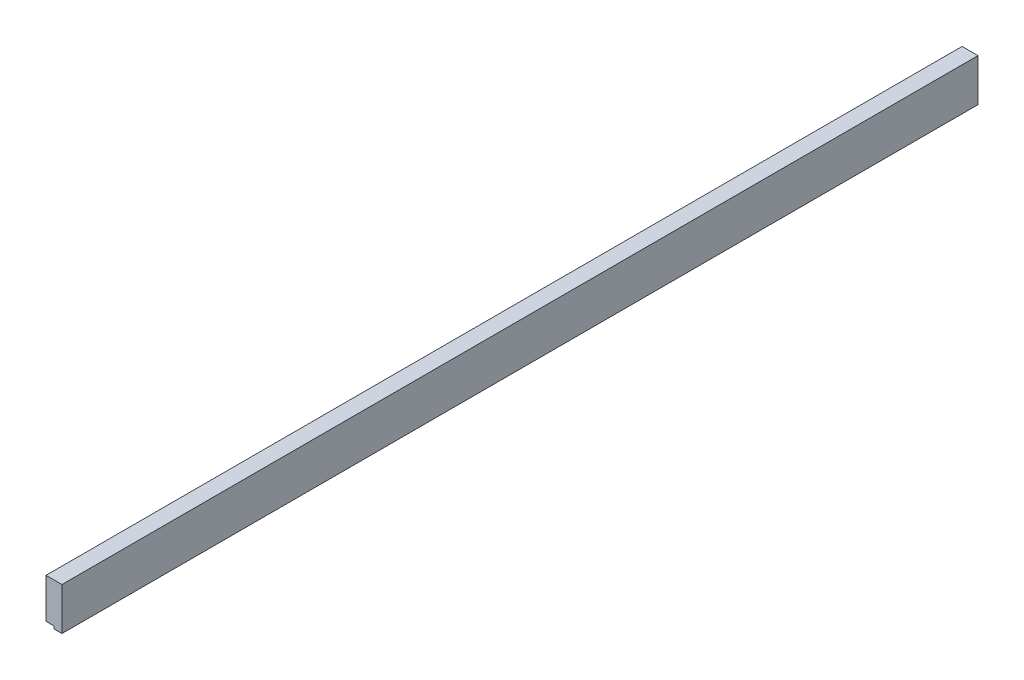
ISO-10303-21;
HEADER;
FILE_DESCRIPTION(('STEP AP214'),'2;1');
FILE_NAME('part.step','',(''),(''),'','','');
FILE_SCHEMA(('AUTOMOTIVE_DESIGN { 1 0 10303 214 1 1 1 1 }'));
ENDSEC;
DATA;
#1=APPLICATION_CONTEXT('core data for automotive mechanical design processes');
#2=APPLICATION_PROTOCOL_DEFINITION('international standard','automotive_design',2000,#1);
#3=PRODUCT_CONTEXT('',#1,'mechanical');
#4=PRODUCT('Part','Part','',(#3));
#5=PRODUCT_RELATED_PRODUCT_CATEGORY('part','',(#4));
#6=PRODUCT_DEFINITION_FORMATION('','',#4);
#7=PRODUCT_DEFINITION_CONTEXT('part definition',#1,'design');
#8=PRODUCT_DEFINITION('design','',#6,#7);
#9=PRODUCT_DEFINITION_SHAPE('','',#8);
#10=(LENGTH_UNIT() NAMED_UNIT(*) SI_UNIT(.MILLI.,.METRE.));
#11=(NAMED_UNIT(*) PLANE_ANGLE_UNIT() SI_UNIT($,.RADIAN.));
#12=(NAMED_UNIT(*) SI_UNIT($,.STERADIAN.) SOLID_ANGLE_UNIT());
#13=UNCERTAINTY_MEASURE_WITH_UNIT(LENGTH_MEASURE(1.E-05),#10,'distance_accuracy_value','');
#14=(GEOMETRIC_REPRESENTATION_CONTEXT(3) GLOBAL_UNCERTAINTY_ASSIGNED_CONTEXT((#13)) GLOBAL_UNIT_ASSIGNED_CONTEXT((#10,
#11,#12)) REPRESENTATION_CONTEXT('',''));
#15=CARTESIAN_POINT('',(0.,0.,0.));
#16=DIRECTION('',(0.,0.,1.));
#17=DIRECTION('',(1.,0.,0.));
#18=AXIS2_PLACEMENT_3D('',#15,#16,#17);
#19=CARTESIAN_POINT('',(38.1,-50.7999999999999,-1095.375));
#20=DIRECTION('',(0.,1.,0.));
#21=DIRECTION('',(0.,0.,1.));
#22=AXIS2_PLACEMENT_3D('',#19,#20,#21);
#23=PLANE('',#22);
#24=DIRECTION('',(-1.,0.,0.));
#25=VECTOR('',#24,1.);
#26=CARTESIAN_POINT('',(9.525,-50.7999999999999,-695.324999999999));
#27=LINE('',#26,#25);
#28=CARTESIAN_POINT('',(9.525,-50.7999999999999,-695.324999999999));
#29=VERTEX_POINT('',#28);
#30=CARTESIAN_POINT('',(0.,-50.7999999999999,-695.324999999999));
#31=VERTEX_POINT('',#30);
#32=EDGE_CURVE('E206',#29,#31,#27,.T.);
#33=ORIENTED_EDGE('',*,*,#32,.T.);
#34=DIRECTION('',(0.,0.,-1.));
#35=VECTOR('',#34,1.);
#36=CARTESIAN_POINT('',(0.,-50.7999999999999,-1095.375));
#37=LINE('',#36,#35);
#38=CARTESIAN_POINT('',(0.,-50.7999999999999,-1095.375));
#39=VERTEX_POINT('',#38);
#40=EDGE_CURVE('E283',#31,#39,#37,.T.);
#41=ORIENTED_EDGE('',*,*,#40,.T.);
#42=DIRECTION('',(-1.,0.,0.));
#43=VECTOR('',#42,1.);
#44=CARTESIAN_POINT('',(38.1,-50.7999999999999,-1095.375));
#45=LINE('',#44,#43);
#46=CARTESIAN_POINT('',(38.1,-50.7999999999999,-1095.375));
#47=VERTEX_POINT('',#46);
#48=EDGE_CURVE('E41',#47,#39,#45,.T.);
#49=ORIENTED_EDGE('',*,*,#48,.F.);
#50=DIRECTION('',(0.,0.,-1.));
#51=VECTOR('',#50,1.);
#52=CARTESIAN_POINT('',(38.1,-50.7999999999999,-1095.375));
#53=LINE('',#52,#51);
#54=CARTESIAN_POINT('',(38.1,-50.8000000000001,1095.375));
#55=VERTEX_POINT('',#54);
#56=EDGE_CURVE('E273',#55,#47,#53,.T.);
#57=ORIENTED_EDGE('',*,*,#56,.F.);
#58=DIRECTION('',(-1.,0.,0.));
#59=VECTOR('',#58,1.);
#60=CARTESIAN_POINT('',(38.1,-50.8000000000001,1095.375));
#61=LINE('',#60,#59);
#62=CARTESIAN_POINT('',(19.05,-50.8000000000001,1095.375));
#63=VERTEX_POINT('',#62);
#64=EDGE_CURVE('E11',#55,#63,#61,.T.);
#65=ORIENTED_EDGE('',*,*,#64,.T.);
#66=DIRECTION('',(0.,0.,1.));
#67=VECTOR('',#66,1.);
#68=CARTESIAN_POINT('',(19.05,-50.8,0.));
#69=LINE('',#68,#67);
#70=CARTESIAN_POINT('',(19.05,-50.8000000000001,663.575000000001));
#71=VERTEX_POINT('',#70);
#72=EDGE_CURVE('E225',#71,#63,#69,.T.);
#73=ORIENTED_EDGE('',*,*,#72,.F.);
#74=DIRECTION('',(-1.,0.,0.));
#75=VECTOR('',#74,1.);
#76=CARTESIAN_POINT('',(19.05,-50.8000000000001,663.575000000001));
#77=LINE('',#76,#75);
#78=CARTESIAN_POINT('',(0.,-50.8000000000001,663.575000000001));
#79=VERTEX_POINT('',#78);
#80=EDGE_CURVE('E238',#71,#79,#77,.T.);
#81=ORIENTED_EDGE('',*,*,#80,.T.);
#82=CARTESIAN_POINT('',(0.,-50.8000000000001,581.025000000001));
#83=VERTEX_POINT('',#82);
#84=EDGE_CURVE('E284',#79,#83,#37,.T.);
#85=ORIENTED_EDGE('',*,*,#84,.T.);
#86=DIRECTION('',(-1.,0.,0.));
#87=VECTOR('',#86,1.);
#88=CARTESIAN_POINT('',(9.525,-50.8000000000001,581.025000000001));
#89=LINE('',#88,#87);
#90=CARTESIAN_POINT('',(9.525,-50.8000000000001,581.025000000001));
#91=VERTEX_POINT('',#90);
#92=EDGE_CURVE('E56',#91,#83,#89,.T.);
#93=ORIENTED_EDGE('',*,*,#92,.F.);
#94=DIRECTION('',(0.,0.,1.));
#95=VECTOR('',#94,1.);
#96=CARTESIAN_POINT('',(9.525,-50.8,0.));
#97=LINE('',#96,#95);
#98=CARTESIAN_POINT('',(9.525,-50.8000000000001,495.300000000001));
#99=VERTEX_POINT('',#98);
#100=EDGE_CURVE('E192',#99,#91,#97,.T.);
#101=ORIENTED_EDGE('',*,*,#100,.F.);
#102=DIRECTION('',(-1.,0.,0.));
#103=VECTOR('',#102,1.);
#104=CARTESIAN_POINT('',(9.525,-50.8000000000001,495.300000000001));
#105=LINE('',#104,#103);
#106=CARTESIAN_POINT('',(0.,-50.8000000000001,495.300000000001));
#107=VERTEX_POINT('',#106);
#108=EDGE_CURVE('E211',#99,#107,#105,.T.);
#109=ORIENTED_EDGE('',*,*,#108,.T.);
#110=CARTESIAN_POINT('',(0.,-50.8000000000001,471.487500000001));
#111=VERTEX_POINT('',#110);
#112=EDGE_CURVE('E288',#107,#111,#37,.T.);
#113=ORIENTED_EDGE('',*,*,#112,.T.);
#114=DIRECTION('',(-1.,0.,0.));
#115=VECTOR('',#114,1.);
#116=CARTESIAN_POINT('',(19.05,-50.8000000000001,471.487500000001));
#117=LINE('',#116,#115);
#118=CARTESIAN_POINT('',(19.05,-50.8000000000001,471.487500000001));
#119=VERTEX_POINT('',#118);
#120=EDGE_CURVE('E253',#119,#111,#117,.T.);
#121=ORIENTED_EDGE('',*,*,#120,.F.);
#122=DIRECTION('',(0.,0.,1.));
#123=VECTOR('',#122,1.);
#124=CARTESIAN_POINT('',(19.05,-50.8,0.));
#125=LINE('',#124,#123);
#126=CARTESIAN_POINT('',(19.05,-50.7999999999999,-585.787499999999));
#127=VERTEX_POINT('',#126);
#128=EDGE_CURVE('E242',#127,#119,#125,.T.);
#129=ORIENTED_EDGE('',*,*,#128,.F.);
#130=DIRECTION('',(-1.,0.,0.));
#131=VECTOR('',#130,1.);
#132=CARTESIAN_POINT('',(19.05,-50.7999999999999,-585.787499999999));
#133=LINE('',#132,#131);
#134=CARTESIAN_POINT('',(0.,-50.7999999999999,-585.787499999999));
#135=VERTEX_POINT('',#134);
#136=EDGE_CURVE('E261',#127,#135,#133,.T.);
#137=ORIENTED_EDGE('',*,*,#136,.T.);
#138=CARTESIAN_POINT('',(0.,-50.7999999999999,-609.599999999999));
#139=VERTEX_POINT('',#138);
#140=EDGE_CURVE('E185',#135,#139,#37,.T.);
#141=ORIENTED_EDGE('',*,*,#140,.T.);
#142=DIRECTION('',(-1.,0.,0.));
#143=VECTOR('',#142,1.);
#144=CARTESIAN_POINT('',(9.525,-50.7999999999999,-609.599999999999));
#145=LINE('',#144,#143);
#146=CARTESIAN_POINT('',(9.525,-50.7999999999999,-609.599999999999));
#147=VERTEX_POINT('',#146);
#148=EDGE_CURVE('E48',#147,#139,#145,.T.);
#149=ORIENTED_EDGE('',*,*,#148,.F.);
#150=DIRECTION('',(0.,0.,1.));
#151=VECTOR('',#150,1.);
#152=CARTESIAN_POINT('',(9.525,-50.8,0.));
#153=LINE('',#152,#151);
#154=EDGE_CURVE('E172',#29,#147,#153,.T.);
#155=ORIENTED_EDGE('',*,*,#154,.F.);
#156=EDGE_LOOP('',(#33,#41,#49,#57,#65,#73,#81,#85,#93,#101,#109,#113,#121,#129,#137,#141,#149,#155));
#157=FACE_BOUND('',#156,.T.);
#158=ADVANCED_FACE('F33',(#157),#23,.F.);
#159=CARTESIAN_POINT('',(0.,0.,0.));
#160=DIRECTION('',(-1.,0.,0.));
#161=DIRECTION('',(0.,0.,1.));
#162=AXIS2_PLACEMENT_3D('',#159,#160,#161);
#163=PLANE('',#162);
#164=ORIENTED_EDGE('',*,*,#40,.F.);
#165=DIRECTION('',(0.,1.,0.));
#166=VECTOR('',#165,1.);
#167=CARTESIAN_POINT('',(0.,0.,-695.324999999999));
#168=LINE('',#167,#166);
#169=CARTESIAN_POINT('',(0.,-25.4000000000001,-695.324999999999));
#170=VERTEX_POINT('',#169);
#171=EDGE_CURVE('E180',#31,#170,#168,.T.);
#172=ORIENTED_EDGE('',*,*,#171,.T.);
#173=DIRECTION('',(0.,0.,1.));
#174=VECTOR('',#173,1.);
#175=CARTESIAN_POINT('',(0.,-25.4000000000001,0.));
#176=LINE('',#175,#174);
#177=CARTESIAN_POINT('',(0.,-25.4000000000001,-609.599999999999));
#178=VERTEX_POINT('',#177);
#179=EDGE_CURVE('E384',#170,#178,#176,.T.);
#180=ORIENTED_EDGE('',*,*,#179,.T.);
#181=DIRECTION('',(0.,1.,0.));
#182=VECTOR('',#181,1.);
#183=CARTESIAN_POINT('',(0.,0.,-609.599999999999));
#184=LINE('',#183,#182);
#185=EDGE_CURVE('E379',#139,#178,#184,.T.);
#186=ORIENTED_EDGE('',*,*,#185,.F.);
#187=ORIENTED_EDGE('',*,*,#140,.F.);
#188=DIRECTION('',(0.,1.,0.));
#189=VECTOR('',#188,1.);
#190=CARTESIAN_POINT('',(0.,0.,-585.787499999999));
#191=LINE('',#190,#189);
#192=CARTESIAN_POINT('',(0.,-12.7000000000001,-585.787499999999));
#193=VERTEX_POINT('',#192);
#194=EDGE_CURVE('E246',#135,#193,#191,.T.);
#195=ORIENTED_EDGE('',*,*,#194,.T.);
#196=DIRECTION('',(0.,0.,1.));
#197=VECTOR('',#196,1.);
#198=CARTESIAN_POINT('',(0.,-12.7000000000001,0.));
#199=LINE('',#198,#197);
#200=CARTESIAN_POINT('',(0.,-12.7000000000001,471.487500000001));
#201=VERTEX_POINT('',#200);
#202=EDGE_CURVE('E256',#193,#201,#199,.T.);
#203=ORIENTED_EDGE('',*,*,#202,.T.);
#204=DIRECTION('',(0.,1.,0.));
#205=VECTOR('',#204,1.);
#206=CARTESIAN_POINT('',(0.,0.,471.487500000001));
#207=LINE('',#206,#205);
#208=EDGE_CURVE('E237',#111,#201,#207,.T.);
#209=ORIENTED_EDGE('',*,*,#208,.F.);
#210=ORIENTED_EDGE('',*,*,#112,.F.);
#211=DIRECTION('',(0.,1.,0.));
#212=VECTOR('',#211,1.);
#213=CARTESIAN_POINT('',(0.,0.,495.300000000001));
#214=LINE('',#213,#212);
#215=CARTESIAN_POINT('',(0.,-25.4000000000001,495.300000000001));
#216=VERTEX_POINT('',#215);
#217=EDGE_CURVE('E196',#107,#216,#214,.T.);
#218=ORIENTED_EDGE('',*,*,#217,.T.);
#219=DIRECTION('',(0.,0.,1.));
#220=VECTOR('',#219,1.);
#221=CARTESIAN_POINT('',(0.,-25.4000000000001,0.));
#222=LINE('',#221,#220);
#223=CARTESIAN_POINT('',(0.,-25.4000000000001,581.025000000001));
#224=VERTEX_POINT('',#223);
#225=EDGE_CURVE('E205',#216,#224,#222,.T.);
#226=ORIENTED_EDGE('',*,*,#225,.T.);
#227=DIRECTION('',(0.,1.,0.));
#228=VECTOR('',#227,1.);
#229=CARTESIAN_POINT('',(0.,0.,581.025000000001));
#230=LINE('',#229,#228);
#231=EDGE_CURVE('E203',#83,#224,#230,.T.);
#232=ORIENTED_EDGE('',*,*,#231,.F.);
#233=ORIENTED_EDGE('',*,*,#84,.F.);
#234=DIRECTION('',(0.,1.,0.));
#235=VECTOR('',#234,1.);
#236=CARTESIAN_POINT('',(0.,0.,663.575000000001));
#237=LINE('',#236,#235);
#238=CARTESIAN_POINT('',(0.,-44.4500000000001,663.575000000001));
#239=VERTEX_POINT('',#238);
#240=EDGE_CURVE('E223',#79,#239,#237,.T.);
#241=ORIENTED_EDGE('',*,*,#240,.T.);
#242=DIRECTION('',(0.,0.,1.));
#243=VECTOR('',#242,1.);
#244=CARTESIAN_POINT('',(0.,-44.4500000000001,0.));
#245=LINE('',#244,#243);
#246=CARTESIAN_POINT('',(0.,-44.4500000000001,1095.375));
#247=VERTEX_POINT('',#246);
#248=EDGE_CURVE('E214',#239,#247,#245,.T.);
#249=ORIENTED_EDGE('',*,*,#248,.T.);
#250=DIRECTION('',(0.,-1.,0.));
#251=VECTOR('',#250,1.);
#252=CARTESIAN_POINT('',(0.,50.7999999999999,1095.375));
#253=LINE('',#252,#251);
#254=CARTESIAN_POINT('',(0.,50.7999999999999,1095.375));
#255=VERTEX_POINT('',#254);
#256=EDGE_CURVE('E263',#255,#247,#253,.T.);
#257=ORIENTED_EDGE('',*,*,#256,.F.);
#258=DIRECTION('',(0.,0.,1.));
#259=VECTOR('',#258,1.);
#260=CARTESIAN_POINT('',(0.,50.8000000000001,-1095.375));
#261=LINE('',#260,#259);
#262=CARTESIAN_POINT('',(0.,50.8000000000001,-1095.375));
#263=VERTEX_POINT('',#262);
#264=EDGE_CURVE('E274',#263,#255,#261,.T.);
#265=ORIENTED_EDGE('',*,*,#264,.F.);
#266=DIRECTION('',(0.,1.,0.));
#267=VECTOR('',#266,1.);
#268=CARTESIAN_POINT('',(0.,50.8000000000001,-1095.375));
#269=LINE('',#268,#267);
#270=EDGE_CURVE('E287',#39,#263,#269,.T.);
#271=ORIENTED_EDGE('',*,*,#270,.F.);
#272=EDGE_LOOP('',(#164,#172,#180,#186,#187,#195,#203,#209,#210,#218,#226,#232,#233,#241,#249,
#257,#265,#271));
#273=FACE_BOUND('',#272,.T.);
#274=ADVANCED_FACE('F305',(#273),#163,.T.);
#275=CARTESIAN_POINT('',(38.1,50.7999999999999,1095.375));
#276=DIRECTION('',(0.,0.,-1.));
#277=DIRECTION('',(-1.,0.,0.));
#278=AXIS2_PLACEMENT_3D('',#275,#276,#277);
#279=PLANE('',#278);
#280=DIRECTION('',(-1.,0.,0.));
#281=VECTOR('',#280,1.);
#282=CARTESIAN_POINT('',(19.05,-44.4500000000001,1095.375));
#283=LINE('',#282,#281);
#284=CARTESIAN_POINT('',(19.05,-44.4500000000001,1095.375));
#285=VERTEX_POINT('',#284);
#286=EDGE_CURVE('E235',#285,#247,#283,.T.);
#287=ORIENTED_EDGE('',*,*,#286,.F.);
#288=DIRECTION('',(0.,1.,0.));
#289=VECTOR('',#288,1.);
#290=CARTESIAN_POINT('',(19.05,0.,1095.375));
#291=LINE('',#290,#289);
#292=EDGE_CURVE('E227',#63,#285,#291,.T.);
#293=ORIENTED_EDGE('',*,*,#292,.F.);
#294=ORIENTED_EDGE('',*,*,#64,.F.);
#295=DIRECTION('',(0.,-1.,0.));
#296=VECTOR('',#295,1.);
#297=CARTESIAN_POINT('',(38.1,50.7999999999999,1095.375));
#298=LINE('',#297,#296);
#299=CARTESIAN_POINT('',(38.1,50.7999999999999,1095.375));
#300=VERTEX_POINT('',#299);
#301=EDGE_CURVE('E270',#300,#55,#298,.T.);
#302=ORIENTED_EDGE('',*,*,#301,.F.);
#303=DIRECTION('',(-1.,0.,0.));
#304=VECTOR('',#303,1.);
#305=CARTESIAN_POINT('',(38.1,50.7999999999999,1095.375));
#306=LINE('',#305,#304);
#307=EDGE_CURVE('E280',#300,#255,#306,.T.);
#308=ORIENTED_EDGE('',*,*,#307,.T.);
#309=ORIENTED_EDGE('',*,*,#256,.T.);
#310=EDGE_LOOP('',(#287,#293,#294,#302,#308,#309));
#311=FACE_BOUND('',#310,.T.);
#312=ADVANCED_FACE('F35',(#311),#279,.F.);
#313=CARTESIAN_POINT('',(38.1,50.8000000000001,-1095.375));
#314=DIRECTION('',(0.,0.,1.));
#315=DIRECTION('',(1.,0.,0.));
#316=AXIS2_PLACEMENT_3D('',#313,#314,#315);
#317=PLANE('',#316);
#318=ORIENTED_EDGE('',*,*,#270,.T.);
#319=DIRECTION('',(-1.,0.,0.));
#320=VECTOR('',#319,1.);
#321=CARTESIAN_POINT('',(38.1,50.8000000000001,-1095.375));
#322=LINE('',#321,#320);
#323=CARTESIAN_POINT('',(38.1,50.8000000000001,-1095.375));
#324=VERTEX_POINT('',#323);
#325=EDGE_CURVE('E293',#324,#263,#322,.T.);
#326=ORIENTED_EDGE('',*,*,#325,.F.);
#327=DIRECTION('',(0.,1.,0.));
#328=VECTOR('',#327,1.);
#329=CARTESIAN_POINT('',(38.1,50.8000000000001,-1095.375));
#330=LINE('',#329,#328);
#331=EDGE_CURVE('E276',#47,#324,#330,.T.);
#332=ORIENTED_EDGE('',*,*,#331,.F.);
#333=ORIENTED_EDGE('',*,*,#48,.T.);
#334=EDGE_LOOP('',(#318,#326,#332,#333));
#335=FACE_BOUND('',#334,.T.);
#336=ADVANCED_FACE('F300',(#335),#317,.F.);
#337=CARTESIAN_POINT('',(38.1,50.8000000000001,-1095.375));
#338=DIRECTION('',(0.,-1.,0.));
#339=DIRECTION('',(0.,0.,-1.));
#340=AXIS2_PLACEMENT_3D('',#337,#338,#339);
#341=PLANE('',#340);
#342=ORIENTED_EDGE('',*,*,#264,.T.);
#343=ORIENTED_EDGE('',*,*,#307,.F.);
#344=DIRECTION('',(0.,0.,1.));
#345=VECTOR('',#344,1.);
#346=CARTESIAN_POINT('',(38.1,50.8000000000001,-1095.375));
#347=LINE('',#346,#345);
#348=EDGE_CURVE('E278',#324,#300,#347,.T.);
#349=ORIENTED_EDGE('',*,*,#348,.F.);
#350=ORIENTED_EDGE('',*,*,#325,.T.);
#351=EDGE_LOOP('',(#342,#343,#349,#350));
#352=FACE_BOUND('',#351,.T.);
#353=ADVANCED_FACE('F310',(#352),#341,.F.);
#354=CARTESIAN_POINT('',(38.1,0.,0.));
#355=DIRECTION('',(-1.,0.,0.));
#356=DIRECTION('',(0.,0.,1.));
#357=AXIS2_PLACEMENT_3D('',#354,#355,#356);
#358=PLANE('',#357);
#359=ORIENTED_EDGE('',*,*,#301,.T.);
#360=ORIENTED_EDGE('',*,*,#56,.T.);
#361=ORIENTED_EDGE('',*,*,#331,.T.);
#362=ORIENTED_EDGE('',*,*,#348,.T.);
#363=EDGE_LOOP('',(#359,#360,#361,#362));
#364=FACE_BOUND('',#363,.T.);
#365=ADVANCED_FACE('F318',(#364),#358,.F.);
#366=CARTESIAN_POINT('',(19.05,0.,-585.787499999999));
#367=DIRECTION('',(0.,0.,1.));
#368=DIRECTION('',(1.,0.,0.));
#369=AXIS2_PLACEMENT_3D('',#366,#367,#368);
#370=PLANE('',#369);
#371=ORIENTED_EDGE('',*,*,#194,.F.);
#372=ORIENTED_EDGE('',*,*,#136,.F.);
#373=DIRECTION('',(0.,1.,0.));
#374=VECTOR('',#373,1.);
#375=CARTESIAN_POINT('',(19.05,0.,-585.787499999999));
#376=LINE('',#375,#374);
#377=CARTESIAN_POINT('',(19.05,-12.7000000000001,-585.787499999999));
#378=VERTEX_POINT('',#377);
#379=EDGE_CURVE('E251',#127,#378,#376,.T.);
#380=ORIENTED_EDGE('',*,*,#379,.T.);
#381=DIRECTION('',(-1.,0.,0.));
#382=VECTOR('',#381,1.);
#383=CARTESIAN_POINT('',(19.05,-12.7000000000001,-585.787499999999));
#384=LINE('',#383,#382);
#385=EDGE_CURVE('E264',#378,#193,#384,.T.);
#386=ORIENTED_EDGE('',*,*,#385,.T.);
#387=EDGE_LOOP('',(#371,#372,#380,#386));
#388=FACE_BOUND('',#387,.T.);
#389=ADVANCED_FACE('F353',(#388),#370,.T.);
#390=CARTESIAN_POINT('',(19.05,-12.7000000000001,0.));
#391=DIRECTION('',(0.,-1.,0.));
#392=DIRECTION('',(0.,0.,-1.));
#393=AXIS2_PLACEMENT_3D('',#390,#391,#392);
#394=PLANE('',#393);
#395=ORIENTED_EDGE('',*,*,#202,.F.);
#396=ORIENTED_EDGE('',*,*,#385,.F.);
#397=DIRECTION('',(0.,0.,1.));
#398=VECTOR('',#397,1.);
#399=CARTESIAN_POINT('',(19.05,-12.7000000000001,0.));
#400=LINE('',#399,#398);
#401=CARTESIAN_POINT('',(19.05,-12.7000000000001,471.487500000001));
#402=VERTEX_POINT('',#401);
#403=EDGE_CURVE('E249',#378,#402,#400,.T.);
#404=ORIENTED_EDGE('',*,*,#403,.T.);
#405=DIRECTION('',(-1.,0.,0.));
#406=VECTOR('',#405,1.);
#407=CARTESIAN_POINT('',(19.05,-12.7000000000001,471.487500000001));
#408=LINE('',#407,#406);
#409=EDGE_CURVE('E266',#402,#201,#408,.T.);
#410=ORIENTED_EDGE('',*,*,#409,.T.);
#411=EDGE_LOOP('',(#395,#396,#404,#410));
#412=FACE_BOUND('',#411,.T.);
#413=ADVANCED_FACE('F357',(#412),#394,.T.);
#414=CARTESIAN_POINT('',(19.05,0.,471.487500000001));
#415=DIRECTION('',(0.,0.,1.));
#416=DIRECTION('',(1.,0.,0.));
#417=AXIS2_PLACEMENT_3D('',#414,#415,#416);
#418=PLANE('',#417);
#419=ORIENTED_EDGE('',*,*,#208,.T.);
#420=ORIENTED_EDGE('',*,*,#409,.F.);
#421=DIRECTION('',(0.,1.,0.));
#422=VECTOR('',#421,1.);
#423=CARTESIAN_POINT('',(19.05,0.,471.487500000001));
#424=LINE('',#423,#422);
#425=EDGE_CURVE('E245',#119,#402,#424,.T.);
#426=ORIENTED_EDGE('',*,*,#425,.F.);
#427=ORIENTED_EDGE('',*,*,#120,.T.);
#428=EDGE_LOOP('',(#419,#420,#426,#427));
#429=FACE_BOUND('',#428,.T.);
#430=ADVANCED_FACE('F354',(#429),#418,.F.);
#431=CARTESIAN_POINT('',(19.05,0.,0.));
#432=DIRECTION('',(-1.,0.,0.));
#433=DIRECTION('',(0.,0.,1.));
#434=AXIS2_PLACEMENT_3D('',#431,#432,#433);
#435=PLANE('',#434);
#436=ORIENTED_EDGE('',*,*,#128,.T.);
#437=ORIENTED_EDGE('',*,*,#425,.T.);
#438=ORIENTED_EDGE('',*,*,#403,.F.);
#439=ORIENTED_EDGE('',*,*,#379,.F.);
#440=EDGE_LOOP('',(#436,#437,#438,#439));
#441=FACE_BOUND('',#440,.T.);
#442=ADVANCED_FACE('F339',(#441),#435,.T.);
#443=CARTESIAN_POINT('',(19.05,-44.4500000000001,0.));
#444=DIRECTION('',(0.,-1.,0.));
#445=DIRECTION('',(0.,0.,-1.));
#446=AXIS2_PLACEMENT_3D('',#443,#444,#445);
#447=PLANE('',#446);
#448=ORIENTED_EDGE('',*,*,#248,.F.);
#449=DIRECTION('',(-1.,0.,0.));
#450=VECTOR('',#449,1.);
#451=CARTESIAN_POINT('',(19.05,-44.4500000000001,663.575000000001));
#452=LINE('',#451,#450);
#453=CARTESIAN_POINT('',(19.05,-44.4500000000001,663.575000000001));
#454=VERTEX_POINT('',#453);
#455=EDGE_CURVE('E230',#454,#239,#452,.T.);
#456=ORIENTED_EDGE('',*,*,#455,.F.);
#457=DIRECTION('',(0.,0.,1.));
#458=VECTOR('',#457,1.);
#459=CARTESIAN_POINT('',(19.05,-44.4500000000001,0.));
#460=LINE('',#459,#458);
#461=EDGE_CURVE('E220',#454,#285,#460,.T.);
#462=ORIENTED_EDGE('',*,*,#461,.T.);
#463=ORIENTED_EDGE('',*,*,#286,.T.);
#464=EDGE_LOOP('',(#448,#456,#462,#463));
#465=FACE_BOUND('',#464,.T.);
#466=ADVANCED_FACE('F327',(#465),#447,.T.);
#467=CARTESIAN_POINT('',(19.05,0.,663.575000000001));
#468=DIRECTION('',(0.,0.,1.));
#469=DIRECTION('',(1.,0.,0.));
#470=AXIS2_PLACEMENT_3D('',#467,#468,#469);
#471=PLANE('',#470);
#472=ORIENTED_EDGE('',*,*,#240,.F.);
#473=ORIENTED_EDGE('',*,*,#80,.F.);
#474=DIRECTION('',(0.,1.,0.));
#475=VECTOR('',#474,1.);
#476=CARTESIAN_POINT('',(19.05,0.,663.575000000001));
#477=LINE('',#476,#475);
#478=EDGE_CURVE('E222',#71,#454,#477,.T.);
#479=ORIENTED_EDGE('',*,*,#478,.T.);
#480=ORIENTED_EDGE('',*,*,#455,.T.);
#481=EDGE_LOOP('',(#472,#473,#479,#480));
#482=FACE_BOUND('',#481,.T.);
#483=ADVANCED_FACE('F330',(#482),#471,.T.);
#484=CARTESIAN_POINT('',(19.05,0.,0.));
#485=DIRECTION('',(-1.,0.,0.));
#486=DIRECTION('',(0.,0.,1.));
#487=AXIS2_PLACEMENT_3D('',#484,#485,#486);
#488=PLANE('',#487);
#489=ORIENTED_EDGE('',*,*,#461,.F.);
#490=ORIENTED_EDGE('',*,*,#478,.F.);
#491=ORIENTED_EDGE('',*,*,#72,.T.);
#492=ORIENTED_EDGE('',*,*,#292,.T.);
#493=EDGE_LOOP('',(#489,#490,#491,#492));
#494=FACE_BOUND('',#493,.T.);
#495=ADVANCED_FACE('F324',(#494),#488,.T.);
#496=CARTESIAN_POINT('',(9.525,0.,495.300000000001));
#497=DIRECTION('',(0.,0.,1.));
#498=DIRECTION('',(1.,0.,0.));
#499=AXIS2_PLACEMENT_3D('',#496,#497,#498);
#500=PLANE('',#499);
#501=ORIENTED_EDGE('',*,*,#217,.F.);
#502=ORIENTED_EDGE('',*,*,#108,.F.);
#503=DIRECTION('',(0.,1.,0.));
#504=VECTOR('',#503,1.);
#505=CARTESIAN_POINT('',(9.525,0.,495.300000000001));
#506=LINE('',#505,#504);
#507=CARTESIAN_POINT('',(9.525,-25.4000000000001,495.300000000001));
#508=VERTEX_POINT('',#507);
#509=EDGE_CURVE('E201',#99,#508,#506,.T.);
#510=ORIENTED_EDGE('',*,*,#509,.T.);
#511=DIRECTION('',(-1.,0.,0.));
#512=VECTOR('',#511,1.);
#513=CARTESIAN_POINT('',(9.525,-25.4000000000001,495.300000000001));
#514=LINE('',#513,#512);
#515=EDGE_CURVE('E215',#508,#216,#514,.T.);
#516=ORIENTED_EDGE('',*,*,#515,.T.);
#517=EDGE_LOOP('',(#501,#502,#510,#516));
#518=FACE_BOUND('',#517,.T.);
#519=ADVANCED_FACE('F337',(#518),#500,.T.);
#520=CARTESIAN_POINT('',(9.525,-25.4000000000001,0.));
#521=DIRECTION('',(0.,-1.,0.));
#522=DIRECTION('',(0.,0.,-1.));
#523=AXIS2_PLACEMENT_3D('',#520,#521,#522);
#524=PLANE('',#523);
#525=ORIENTED_EDGE('',*,*,#225,.F.);
#526=ORIENTED_EDGE('',*,*,#515,.F.);
#527=DIRECTION('',(0.,0.,1.));
#528=VECTOR('',#527,1.);
#529=CARTESIAN_POINT('',(9.525,-25.4000000000001,0.));
#530=LINE('',#529,#528);
#531=CARTESIAN_POINT('',(9.525,-25.4000000000001,581.025000000001));
#532=VERTEX_POINT('',#531);
#533=EDGE_CURVE('E199',#508,#532,#530,.T.);
#534=ORIENTED_EDGE('',*,*,#533,.T.);
#535=DIRECTION('',(-1.,0.,0.));
#536=VECTOR('',#535,1.);
#537=CARTESIAN_POINT('',(9.525,-25.4000000000001,581.025000000001));
#538=LINE('',#537,#536);
#539=EDGE_CURVE('E217',#532,#224,#538,.T.);
#540=ORIENTED_EDGE('',*,*,#539,.T.);
#541=EDGE_LOOP('',(#525,#526,#534,#540));
#542=FACE_BOUND('',#541,.T.);
#543=ADVANCED_FACE('F409',(#542),#524,.T.);
#544=CARTESIAN_POINT('',(9.525,0.,581.025000000001));
#545=DIRECTION('',(0.,0.,1.));
#546=DIRECTION('',(1.,0.,0.));
#547=AXIS2_PLACEMENT_3D('',#544,#545,#546);
#548=PLANE('',#547);
#549=ORIENTED_EDGE('',*,*,#231,.T.);
#550=ORIENTED_EDGE('',*,*,#539,.F.);
#551=DIRECTION('',(0.,1.,0.));
#552=VECTOR('',#551,1.);
#553=CARTESIAN_POINT('',(9.525,0.,581.025000000001));
#554=LINE('',#553,#552);
#555=EDGE_CURVE('E195',#91,#532,#554,.T.);
#556=ORIENTED_EDGE('',*,*,#555,.F.);
#557=ORIENTED_EDGE('',*,*,#92,.T.);
#558=EDGE_LOOP('',(#549,#550,#556,#557));
#559=FACE_BOUND('',#558,.T.);
#560=ADVANCED_FACE('F400',(#559),#548,.F.);
#561=CARTESIAN_POINT('',(9.525,0.,0.));
#562=DIRECTION('',(-1.,0.,0.));
#563=DIRECTION('',(0.,0.,1.));
#564=AXIS2_PLACEMENT_3D('',#561,#562,#563);
#565=PLANE('',#564);
#566=ORIENTED_EDGE('',*,*,#100,.T.);
#567=ORIENTED_EDGE('',*,*,#555,.T.);
#568=ORIENTED_EDGE('',*,*,#533,.F.);
#569=ORIENTED_EDGE('',*,*,#509,.F.);
#570=EDGE_LOOP('',(#566,#567,#568,#569));
#571=FACE_BOUND('',#570,.T.);
#572=ADVANCED_FACE('F393',(#571),#565,.T.);
#573=CARTESIAN_POINT('',(9.525,0.,-695.324999999999));
#574=DIRECTION('',(0.,0.,1.));
#575=DIRECTION('',(1.,0.,0.));
#576=AXIS2_PLACEMENT_3D('',#573,#574,#575);
#577=PLANE('',#576);
#578=ORIENTED_EDGE('',*,*,#171,.F.);
#579=ORIENTED_EDGE('',*,*,#32,.F.);
#580=DIRECTION('',(0.,1.,0.));
#581=VECTOR('',#580,1.);
#582=CARTESIAN_POINT('',(9.525,0.,-695.324999999999));
#583=LINE('',#582,#581);
#584=CARTESIAN_POINT('',(9.525,-25.4000000000001,-695.324999999999));
#585=VERTEX_POINT('',#584);
#586=EDGE_CURVE('E177',#29,#585,#583,.T.);
#587=ORIENTED_EDGE('',*,*,#586,.T.);
#588=DIRECTION('',(-1.,0.,0.));
#589=VECTOR('',#588,1.);
#590=CARTESIAN_POINT('',(9.525,-25.4000000000001,-695.324999999999));
#591=LINE('',#590,#589);
#592=EDGE_CURVE('E187',#585,#170,#591,.T.);
#593=ORIENTED_EDGE('',*,*,#592,.T.);
#594=EDGE_LOOP('',(#578,#579,#587,#593));
#595=FACE_BOUND('',#594,.T.);
#596=ADVANCED_FACE('F391',(#595),#577,.T.);
#597=CARTESIAN_POINT('',(9.525,-25.4000000000001,0.));
#598=DIRECTION('',(0.,-1.,0.));
#599=DIRECTION('',(0.,0.,-1.));
#600=AXIS2_PLACEMENT_3D('',#597,#598,#599);
#601=PLANE('',#600);
#602=ORIENTED_EDGE('',*,*,#179,.F.);
#603=ORIENTED_EDGE('',*,*,#592,.F.);
#604=DIRECTION('',(0.,0.,1.));
#605=VECTOR('',#604,1.);
#606=CARTESIAN_POINT('',(9.525,-25.4000000000001,0.));
#607=LINE('',#606,#605);
#608=CARTESIAN_POINT('',(9.525,-25.4000000000001,-609.599999999999));
#609=VERTEX_POINT('',#608);
#610=EDGE_CURVE('E171',#585,#609,#607,.T.);
#611=ORIENTED_EDGE('',*,*,#610,.T.);
#612=DIRECTION('',(-1.,0.,0.));
#613=VECTOR('',#612,1.);
#614=CARTESIAN_POINT('',(9.525,-25.4000000000001,-609.599999999999));
#615=LINE('',#614,#613);
#616=EDGE_CURVE('E168',#609,#178,#615,.T.);
#617=ORIENTED_EDGE('',*,*,#616,.T.);
#618=EDGE_LOOP('',(#602,#603,#611,#617));
#619=FACE_BOUND('',#618,.T.);
#620=ADVANCED_FACE('F390',(#619),#601,.T.);
#621=CARTESIAN_POINT('',(9.525,0.,-609.599999999999));
#622=DIRECTION('',(0.,0.,1.));
#623=DIRECTION('',(1.,0.,0.));
#624=AXIS2_PLACEMENT_3D('',#621,#622,#623);
#625=PLANE('',#624);
#626=ORIENTED_EDGE('',*,*,#185,.T.);
#627=ORIENTED_EDGE('',*,*,#616,.F.);
#628=DIRECTION('',(0.,1.,0.));
#629=VECTOR('',#628,1.);
#630=CARTESIAN_POINT('',(9.525,0.,-609.599999999999));
#631=LINE('',#630,#629);
#632=EDGE_CURVE('E165',#147,#609,#631,.T.);
#633=ORIENTED_EDGE('',*,*,#632,.F.);
#634=ORIENTED_EDGE('',*,*,#148,.T.);
#635=EDGE_LOOP('',(#626,#627,#633,#634));
#636=FACE_BOUND('',#635,.T.);
#637=ADVANCED_FACE('F167',(#636),#625,.F.);
#638=CARTESIAN_POINT('',(9.525,0.,0.));
#639=DIRECTION('',(-1.,0.,0.));
#640=DIRECTION('',(0.,0.,1.));
#641=AXIS2_PLACEMENT_3D('',#638,#639,#640);
#642=PLANE('',#641);
#643=ORIENTED_EDGE('',*,*,#154,.T.);
#644=ORIENTED_EDGE('',*,*,#632,.T.);
#645=ORIENTED_EDGE('',*,*,#610,.F.);
#646=ORIENTED_EDGE('',*,*,#586,.F.);
#647=EDGE_LOOP('',(#643,#644,#645,#646));
#648=FACE_BOUND('',#647,.T.);
#649=ADVANCED_FACE('F176',(#648),#642,.T.);
#650=CLOSED_SHELL('',(#158,#274,#312,#336,#353,#365,#389,#413,#430,#442,#466,#483,#495,#519,
#543,#560,#572,#596,#620,#637,#649));
#651=MANIFOLD_SOLID_BREP('B2',#650);
#652=ADVANCED_BREP_SHAPE_REPRESENTATION('',(#18,#651),#14);
#653=SHAPE_DEFINITION_REPRESENTATION(#9,#652);
ENDSEC;
END-ISO-10303-21;
